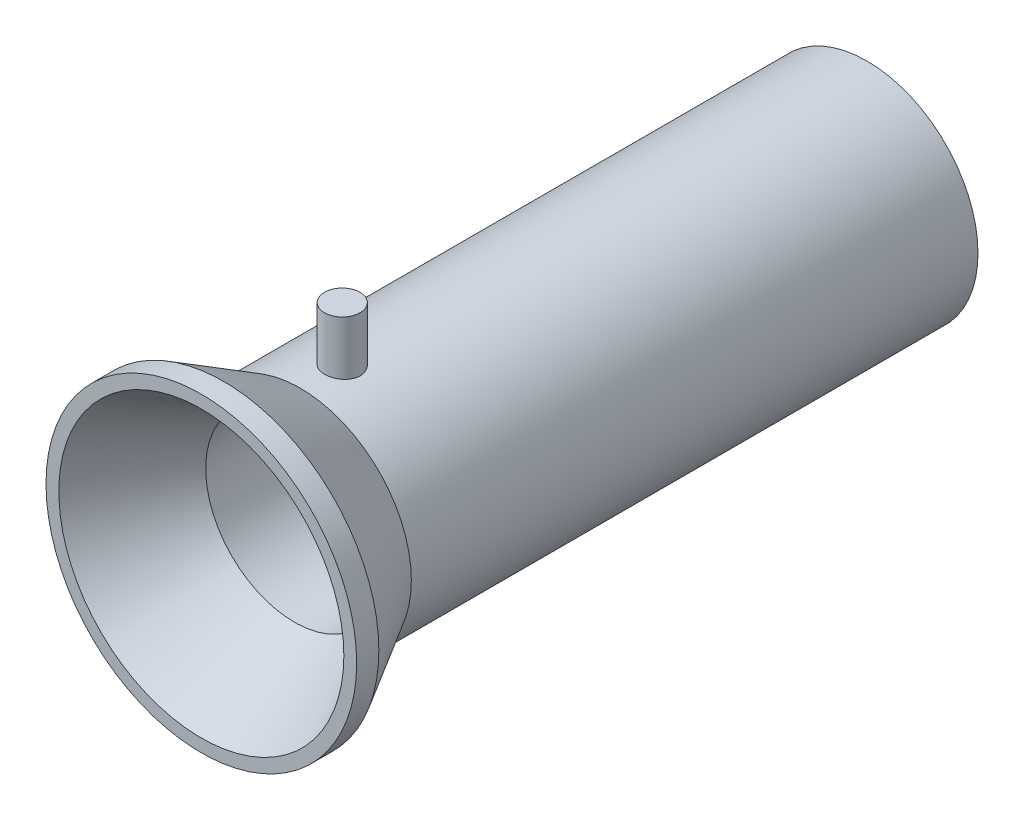
ISO-10303-21;
HEADER;
FILE_DESCRIPTION(('STEP AP214'),'2;1');
FILE_NAME('part.step','',(''),(''),'','','');
FILE_SCHEMA(('AUTOMOTIVE_DESIGN { 1 0 10303 214 1 1 1 1 }'));
ENDSEC;
DATA;
#1=APPLICATION_CONTEXT('core data for automotive mechanical design processes');
#2=APPLICATION_PROTOCOL_DEFINITION('international standard','automotive_design',2000,#1);
#3=PRODUCT_CONTEXT('',#1,'mechanical');
#4=PRODUCT('Part','Part','',(#3));
#5=PRODUCT_RELATED_PRODUCT_CATEGORY('part','',(#4));
#6=PRODUCT_DEFINITION_FORMATION('','',#4);
#7=PRODUCT_DEFINITION_CONTEXT('part definition',#1,'design');
#8=PRODUCT_DEFINITION('design','',#6,#7);
#9=PRODUCT_DEFINITION_SHAPE('','',#8);
#10=(LENGTH_UNIT() NAMED_UNIT(*) SI_UNIT(.MILLI.,.METRE.));
#11=(NAMED_UNIT(*) PLANE_ANGLE_UNIT() SI_UNIT($,.RADIAN.));
#12=(NAMED_UNIT(*) SI_UNIT($,.STERADIAN.) SOLID_ANGLE_UNIT());
#13=UNCERTAINTY_MEASURE_WITH_UNIT(LENGTH_MEASURE(1.E-05),#10,'distance_accuracy_value','');
#14=(GEOMETRIC_REPRESENTATION_CONTEXT(3) GLOBAL_UNCERTAINTY_ASSIGNED_CONTEXT((#13)) GLOBAL_UNIT_ASSIGNED_CONTEXT((#10,
#11,#12)) REPRESENTATION_CONTEXT('',''));
#15=CARTESIAN_POINT('',(0.,0.,0.));
#16=DIRECTION('',(0.,0.,1.));
#17=DIRECTION('',(1.,0.,0.));
#18=AXIS2_PLACEMENT_3D('',#15,#16,#17);
#19=CARTESIAN_POINT('',(0.,0.,0.));
#20=DIRECTION('',(0.,0.,1.));
#21=DIRECTION('',(1.,0.,0.));
#22=AXIS2_PLACEMENT_3D('',#19,#20,#21);
#23=CYLINDRICAL_SURFACE('',#22,25.);
#24=CARTESIAN_POINT('',(0.,25.,-27.7583302491977));
#25=CARTESIAN_POINT('',(0.223154040255867,24.9999962684199,-27.7583393064581));
#26=CARTESIAN_POINT('',(0.446433047720668,24.9969809352746,-27.777067463784));
#27=CARTESIAN_POINT('',(0.886737559316476,24.9852424683713,-27.8514591445937));
#28=CARTESIAN_POINT('',(1.10375697227035,24.9765139586209,-27.907157456998));
#29=CARTESIAN_POINT('',(1.52510754225258,24.9543289280258,-28.0537720100897));
#30=CARTESIAN_POINT('',(1.72944860588801,24.9408761547967,-28.1446603414393));
#31=CARTESIAN_POINT('',(2.11995168869092,24.9107247960231,-28.3590038379933));
#32=CARTESIAN_POINT('',(2.30611596589786,24.8940266144171,-28.482454950965));
#33=CARTESIAN_POINT('',(2.65665499209348,24.8590728580675,-28.7595814577226));
#34=CARTESIAN_POINT('',(2.82084573305194,24.8408060088607,-28.913488207088));
#35=CARTESIAN_POINT('',(3.12118820567566,24.8048607981876,-29.2466591837476));
#36=CARTESIAN_POINT('',(3.25733823381418,24.7871824725299,-29.4259249505351));
#37=CARTESIAN_POINT('',(3.49846330826428,24.7543066715639,-29.8059780215018));
#38=CARTESIAN_POINT('',(3.60325799692193,24.73912376697,-30.0068811239209));
#39=CARTESIAN_POINT('',(3.77754461925213,24.713113318991,-30.4237215749353));
#40=CARTESIAN_POINT('',(3.84703874636018,24.7022855050068,-30.6396579884727));
#41=CARTESIAN_POINT('',(3.94817517362655,24.6863228948473,-31.0784910029273));
#42=CARTESIAN_POINT('',(3.980134089008,24.6811405060072,-31.3013128710978));
#43=CARTESIAN_POINT('',(4.00627422675154,24.6769113431822,-31.7492122233686));
#44=CARTESIAN_POINT('',(4.00045791388385,24.6778641688848,-31.9742895593467));
#45=CARTESIAN_POINT('',(3.95147094116269,24.6857542961208,-32.4180603101956));
#46=CARTESIAN_POINT('',(3.90865469452829,24.6926348158353,-32.6367940039198));
#47=CARTESIAN_POINT('',(3.78743887027681,24.7115162640347,-33.0639323913936));
#48=CARTESIAN_POINT('',(3.70903815991343,24.72351735552,-33.2723367560995));
#49=CARTESIAN_POINT('',(3.51851577494413,24.751349636532,-33.6739687849094));
#50=CARTESIAN_POINT('',(3.40624571635019,24.7671976186138,-33.8671248485685));
#51=CARTESIAN_POINT('',(3.15127705264725,24.8009261622985,-34.2319907925684));
#52=CARTESIAN_POINT('',(3.00857618031073,24.8188068753022,-34.4036990734441));
#53=CARTESIAN_POINT('',(2.69485968175784,24.8548362490508,-34.7228478500724));
#54=CARTESIAN_POINT('',(2.52353971091198,24.8729856400542,-34.8699892633353));
#55=CARTESIAN_POINT('',(2.15848074936105,24.9073185416933,-35.1334797268837));
#56=CARTESIAN_POINT('',(1.96474163443276,24.9235020414351,-35.2498286065379));
#57=CARTESIAN_POINT('',(1.56007177661824,24.9521001139888,-35.4484536054257));
#58=CARTESIAN_POINT('',(1.34912853484306,24.9645119151413,-35.5307046837354));
#59=CARTESIAN_POINT('',(0.916179667879541,24.984145511872,-35.6585289650497));
#60=CARTESIAN_POINT('',(0.694174896141458,24.9913677071923,-35.7041049930718));
#61=CARTESIAN_POINT('',(0.247984110803936,24.9997549291012,-35.7568831892236));
#62=CARTESIAN_POINT('',(0.0238478673208719,25.0009847993513,-35.764496181113));
#63=CARTESIAN_POINT('',(-0.42249874302229,24.9974259501866,-35.7422254859792));
#64=CARTESIAN_POINT('',(-0.644709177708579,24.992637443611,-35.712343124975));
#65=CARTESIAN_POINT('',(-1.07963759647102,24.9776200030468,-35.6162716528192));
#66=CARTESIAN_POINT('',(-1.29240134880417,24.9674213560511,-35.5502845985886));
#67=CARTESIAN_POINT('',(-1.70384598117199,24.9427229229552,-35.3840913121376));
#68=CARTESIAN_POINT('',(-1.90252612198239,24.9282229112907,-35.2838832853215));
#69=CARTESIAN_POINT('',(-2.28195730225774,24.8963704303685,-35.0511422505911));
#70=CARTESIAN_POINT('',(-2.46254800619141,24.8789955511662,-34.9183509771516));
#71=CARTESIAN_POINT('',(-2.79902831279057,24.8433919082741,-34.6245699404727));
#72=CARTESIAN_POINT('',(-2.95491626880566,24.8251630877667,-34.4635782989412));
#73=CARTESIAN_POINT('',(-3.23907733060002,24.7896980546147,-34.1161294729898));
#74=CARTESIAN_POINT('',(-3.3670737482944,24.7724729290756,-33.9294446916241));
#75=CARTESIAN_POINT('',(-3.58988978420239,24.7411682060349,-33.536982686957));
#76=CARTESIAN_POINT('',(-3.68471039247671,24.7270885146691,-33.3312060336435));
#77=CARTESIAN_POINT('',(-3.83806316708309,24.7037508240956,-32.9071963307613));
#78=CARTESIAN_POINT('',(-3.89673629805032,24.6944741175445,-32.689015340002));
#79=CARTESIAN_POINT('',(-3.97657437108919,24.6817446444144,-32.2457351092137));
#80=CARTESIAN_POINT('',(-3.99774229496909,24.6782914148477,-32.020636420616));
#81=CARTESIAN_POINT('',(-4.00189093236788,24.6776187517139,-31.5726712623245));
#82=CARTESIAN_POINT('',(-3.98530695642893,24.680328256433,-31.3498088101182));
#83=CARTESIAN_POINT('',(-3.9153603594595,24.6915205651642,-30.9100876039432));
#84=CARTESIAN_POINT('',(-3.86199783155724,24.7000033545575,-30.6932288347739));
#85=CARTESIAN_POINT('',(-3.72017043710126,24.7217603172402,-30.2718195491648));
#86=CARTESIAN_POINT('',(-3.63174015540267,24.7350297686206,-30.0672571339151));
#87=CARTESIAN_POINT('',(-3.42233154568487,24.7648699534816,-29.6758013138516));
#88=CARTESIAN_POINT('',(-3.30135181249014,24.7814408294783,-29.4889086723212));
#89=CARTESIAN_POINT('',(-3.02871327199353,24.8162433615403,-29.1358930875246));
#90=CARTESIAN_POINT('',(-2.87673329161918,24.834491204356,-28.9700197533969));
#91=CARTESIAN_POINT('',(-2.54708668715905,24.8704600259951,-28.6659794864027));
#92=CARTESIAN_POINT('',(-2.36941412804009,24.8881808819399,-28.5278189729003));
#93=CARTESIAN_POINT('',(-1.99209669315466,24.921228112583,-28.2823353168541));
#94=CARTESIAN_POINT('',(-1.79232009958969,24.9365386530592,-28.1752125014229));
#95=CARTESIAN_POINT('',(-1.37745033393731,24.9628857500936,-27.9962076633995));
#96=CARTESIAN_POINT('',(-1.16237292241951,24.9739266312466,-27.9242899629898));
#97=CARTESIAN_POINT('',(-0.788671037676078,24.9880351179278,-27.8336387717268));
#98=CARTESIAN_POINT('',(-0.632326954997383,24.9924983556635,-27.8054424436121));
#99=CARTESIAN_POINT('',(-0.317342960303406,24.9984821013428,-27.7677851034705));
#100=CARTESIAN_POINT('',(-0.158703083077655,25.0000026538317,-27.7583238078393));
#101=CARTESIAN_POINT('',(0.,25.,-27.7583302491977));
#102=B_SPLINE_CURVE_WITH_KNOTS('',3,(#24,#25,#26,#27,#28,#29,#30,#31,#32,#33,#34,#35,#36,#37,
#38,#39,#40,#41,#42,#43,#44,#45,#46,#47,#48,#49,#50,#51,#52,#53,#54,#55,#56,#57,#58,#59,#60,#61,
#62,#63,#64,#65,#66,#67,#68,#69,#70,#71,#72,#73,#74,#75,#76,#77,#78,#79,#80,#81,#82,#83,#84,#85,
#86,#87,#88,#89,#90,#91,#92,#93,#94,#95,#96,#97,#98,#99,#100,#101),.UNSPECIFIED.,.T.,.F.,(4,2,2,
2,2,2,2,2,2,2,2,2,2,2,2,2,2,2,2,2,2,2,2,2,2,2,2,2,2,2,2,2,2,2,2,2,2,2,4),(0.,0.66888209324589,
1.33839449863893,2.00737699531371,2.67627628058208,3.35046669216468,4.02469805002561,
4.70273619251891,5.38073219928275,6.05296716939299,6.72515827774052,7.39098111780999,
8.05682515424385,8.72562974136637,9.39448417474969,10.0709662667478,10.7474521072744,
11.4244338727204,12.1013634864039,12.7709514430023,13.4405157203627,14.106370604541,
14.7722604124451,15.4436091856769,16.1150026912654,16.7927805417321,17.4705381636504,
18.1456357152063,18.8206795915005,19.4879791369228,20.1552769926597,20.8219183697352,
21.4885885306597,22.1625526170809,22.8366726398947,23.5150513730047,24.1927411880703,
24.6684451333997,25.144141877639),.UNSPECIFIED.);
#103=CARTESIAN_POINT('',(0.,25.,-27.7583302491977));
#104=VERTEX_POINT('',#103);
#105=EDGE_CURVE('E65',#104,#104,#102,.T.);
#106=ORIENTED_EDGE('',*,*,#105,.F.);
#107=EDGE_LOOP('',(#106));
#108=FACE_BOUND('',#107,.T.);
#109=CARTESIAN_POINT('',(0.,0.,-22.3205080756887));
#110=DIRECTION('',(0.,0.,1.));
#111=DIRECTION('',(1.,0.,0.));
#112=AXIS2_PLACEMENT_3D('',#109,#110,#111);
#113=CIRCLE('',#112,25.);
#114=CARTESIAN_POINT('',(25.,0.,-22.3205080756887));
#115=VERTEX_POINT('',#114);
#116=EDGE_CURVE('E49',#115,#115,#113,.T.);
#117=ORIENTED_EDGE('',*,*,#116,.F.);
#118=EDGE_LOOP('',(#117));
#119=FACE_BOUND('',#118,.T.);
#120=CARTESIAN_POINT('',(0.,-25.,-35.7583302491977));
#121=CARTESIAN_POINT('',(0.223154040255867,-24.9999962684199,-35.7583211919374));
#122=CARTESIAN_POINT('',(0.446433047720668,-24.9969809352746,-35.7395930346114));
#123=CARTESIAN_POINT('',(0.886737559316476,-24.9852424683713,-35.6652013538017));
#124=CARTESIAN_POINT('',(1.10375697227035,-24.9765139586209,-35.6095030413974));
#125=CARTESIAN_POINT('',(1.52510754225258,-24.9543289280258,-35.4628884883057));
#126=CARTESIAN_POINT('',(1.72944860588802,-24.9408761547967,-35.3720001569561));
#127=CARTESIAN_POINT('',(2.11995168869093,-24.9107247960231,-35.1576566604021));
#128=CARTESIAN_POINT('',(2.30611596589787,-24.8940266144171,-35.0342055474304));
#129=CARTESIAN_POINT('',(2.65665499209349,-24.8590728580675,-34.7570790406728));
#130=CARTESIAN_POINT('',(2.82084573305194,-24.8408060088607,-34.6031722913074));
#131=CARTESIAN_POINT('',(3.12118820567566,-24.8048607981876,-34.2700013146478));
#132=CARTESIAN_POINT('',(3.25733823381418,-24.7871824725299,-34.0907355478603));
#133=CARTESIAN_POINT('',(3.49846330826428,-24.7543066715639,-33.7106824768936));
#134=CARTESIAN_POINT('',(3.60325799692193,-24.73912376697,-33.5097793744745));
#135=CARTESIAN_POINT('',(3.77754461925213,-24.713113318991,-33.0929389234601));
#136=CARTESIAN_POINT('',(3.84703874636018,-24.7022855050068,-32.8770025099228));
#137=CARTESIAN_POINT('',(3.94817517362655,-24.6863228948473,-32.4381694954681));
#138=CARTESIAN_POINT('',(3.980134089008,-24.6811405060072,-32.2153476272976));
#139=CARTESIAN_POINT('',(4.00627422675154,-24.6769113431822,-31.7674482750268));
#140=CARTESIAN_POINT('',(4.00045791388385,-24.6778641688848,-31.5423709390487));
#141=CARTESIAN_POINT('',(3.95147094116269,-24.6857542961208,-31.0986001881998));
#142=CARTESIAN_POINT('',(3.90865469452829,-24.6926348158353,-30.8798664944756));
#143=CARTESIAN_POINT('',(3.78743887027681,-24.7115162640347,-30.4527281070018));
#144=CARTESIAN_POINT('',(3.70903815991343,-24.72351735552,-30.2443237422959));
#145=CARTESIAN_POINT('',(3.51851577494413,-24.751349636532,-29.842691713486));
#146=CARTESIAN_POINT('',(3.40624571635019,-24.7671976186138,-29.6495356498269));
#147=CARTESIAN_POINT('',(3.15127705264726,-24.8009261622985,-29.284669705827));
#148=CARTESIAN_POINT('',(3.00857618031073,-24.8188068753022,-29.1129614249513));
#149=CARTESIAN_POINT('',(2.69485968175784,-24.8548362490508,-28.793812648323));
#150=CARTESIAN_POINT('',(2.52353971091198,-24.8729856400542,-28.6466712350601));
#151=CARTESIAN_POINT('',(2.15848074936105,-24.9073185416933,-28.3831807715117));
#152=CARTESIAN_POINT('',(1.96474163443276,-24.9235020414351,-28.2668318918576));
#153=CARTESIAN_POINT('',(1.56007177661824,-24.9521001139888,-28.0682068929697));
#154=CARTESIAN_POINT('',(1.34912853484306,-24.9645119151413,-27.98595581466));
#155=CARTESIAN_POINT('',(0.916179667879539,-24.984145511872,-27.8581315333457));
#156=CARTESIAN_POINT('',(0.694174896141457,-24.9913677071923,-27.8125555053236));
#157=CARTESIAN_POINT('',(0.247984110803936,-24.9997549291012,-27.7597773091718));
#158=CARTESIAN_POINT('',(0.023847867320872,-25.0009847993513,-27.7521643172824));
#159=CARTESIAN_POINT('',(-0.42249874302229,-24.9974259501866,-27.7744350124162));
#160=CARTESIAN_POINT('',(-0.64470917770858,-24.992637443611,-27.8043173734204));
#161=CARTESIAN_POINT('',(-1.07963759647102,-24.9776200030468,-27.9003888455762));
#162=CARTESIAN_POINT('',(-1.29240134880417,-24.9674213560511,-27.9663758998068));
#163=CARTESIAN_POINT('',(-1.70384598117199,-24.9427229229552,-28.1325691862578));
#164=CARTESIAN_POINT('',(-1.90252612198239,-24.9282229112907,-28.2327772130739));
#165=CARTESIAN_POINT('',(-2.28195730225774,-24.8963704303685,-28.4655182478043));
#166=CARTESIAN_POINT('',(-2.46254800619141,-24.8789955511662,-28.5983095212438));
#167=CARTESIAN_POINT('',(-2.79902831279057,-24.8433919082741,-28.8920905579227));
#168=CARTESIAN_POINT('',(-2.95491626880566,-24.8251630877667,-29.0530821994542));
#169=CARTESIAN_POINT('',(-3.23907733060002,-24.7896980546147,-29.4005310254056));
#170=CARTESIAN_POINT('',(-3.3670737482944,-24.7724729290756,-29.5872158067713));
#171=CARTESIAN_POINT('',(-3.5898897842024,-24.7411682060349,-29.9796778114384));
#172=CARTESIAN_POINT('',(-3.68471039247671,-24.7270885146691,-30.1854544647519));
#173=CARTESIAN_POINT('',(-3.83806316708309,-24.7037508240956,-30.6094641676341));
#174=CARTESIAN_POINT('',(-3.89673629805032,-24.6944741175445,-30.8276451583934));
#175=CARTESIAN_POINT('',(-3.97657437108919,-24.6817446444144,-31.2709253891817));
#176=CARTESIAN_POINT('',(-3.99774229496909,-24.6782914148477,-31.4960240777794));
#177=CARTESIAN_POINT('',(-4.00189093236788,-24.6776187517139,-31.943989236071));
#178=CARTESIAN_POINT('',(-3.98530695642893,-24.680328256433,-32.1668516882772));
#179=CARTESIAN_POINT('',(-3.9153603594595,-24.6915205651642,-32.6065728944522));
#180=CARTESIAN_POINT('',(-3.86199783155724,-24.7000033545575,-32.8234316636215));
#181=CARTESIAN_POINT('',(-3.72017043710126,-24.7217603172402,-33.2448409492306));
#182=CARTESIAN_POINT('',(-3.63174015540267,-24.7350297686206,-33.4494033644803));
#183=CARTESIAN_POINT('',(-3.42233154568487,-24.7648699534816,-33.8408591845439));
#184=CARTESIAN_POINT('',(-3.30135181249014,-24.7814408294783,-34.0277518260742));
#185=CARTESIAN_POINT('',(-3.02871327199353,-24.8162433615403,-34.3807674108708));
#186=CARTESIAN_POINT('',(-2.87673329161918,-24.834491204356,-34.5466407449985));
#187=CARTESIAN_POINT('',(-2.54708668715906,-24.8704600259951,-34.8506810119927));
#188=CARTESIAN_POINT('',(-2.36941412804009,-24.8881808819399,-34.9888415254951));
#189=CARTESIAN_POINT('',(-1.99209669315467,-24.921228112583,-35.2343251815413));
#190=CARTESIAN_POINT('',(-1.79232009958969,-24.9365386530592,-35.3414479969725));
#191=CARTESIAN_POINT('',(-1.37745033393731,-24.9628857500936,-35.5204528349959));
#192=CARTESIAN_POINT('',(-1.1623729224195,-24.9739266312466,-35.5923705354057));
#193=CARTESIAN_POINT('',(-0.788671037676074,-24.9880351179278,-35.6830217266687));
#194=CARTESIAN_POINT('',(-0.632326954997379,-24.9924983556635,-35.7112180547833));
#195=CARTESIAN_POINT('',(-0.317342960303403,-24.9984821013428,-35.7488753949249));
#196=CARTESIAN_POINT('',(-0.158703083077654,-25.0000026538317,-35.7583366905561));
#197=CARTESIAN_POINT('',(0.,-25.,-35.7583302491977));
#198=B_SPLINE_CURVE_WITH_KNOTS('',3,(#120,#121,#122,#123,#124,#125,#126,#127,#128,#129,#130,
#131,#132,#133,#134,#135,#136,#137,#138,#139,#140,#141,#142,#143,#144,#145,#146,#147,#148,#149,
#150,#151,#152,#153,#154,#155,#156,#157,#158,#159,#160,#161,#162,#163,#164,#165,#166,#167,#168,
#169,#170,#171,#172,#173,#174,#175,#176,#177,#178,#179,#180,#181,#182,#183,#184,#185,#186,#187,
#188,#189,#190,#191,#192,#193,#194,#195,#196,#197),.UNSPECIFIED.,.T.,.F.,(4,2,2,2,2,2,2,2,2,2,2,
2,2,2,2,2,2,2,2,2,2,2,2,2,2,2,2,2,2,2,2,2,2,2,2,2,2,2,4),(0.,0.668882093245891,1.33839449863894,
2.00737699531371,2.67627628058208,3.35046669216468,4.02469805002561,4.70273619251891,
5.38073219928275,6.052967169393,6.72515827774053,7.39098111780999,8.05682515424385,
8.72562974136636,9.39448417474968,10.0709662667478,10.7474521072744,11.4244338727204,
12.1013634864039,12.7709514430023,13.4405157203627,14.106370604541,14.7722604124451,
15.4436091856769,16.1150026912654,16.7927805417321,17.4705381636504,18.1456357152063,
18.8206795915005,19.4879791369228,20.1552769926597,20.8219183697352,21.4885885306597,
22.1625526170809,22.8366726398947,23.5150513730047,24.1927411880703,24.6684451333997,
25.144141877639),.UNSPECIFIED.);
#199=CARTESIAN_POINT('',(0.,-25.,-35.7583302491977));
#200=VERTEX_POINT('',#199);
#201=EDGE_CURVE('E10',#200,#200,#198,.T.);
#202=ORIENTED_EDGE('',*,*,#201,.F.);
#203=EDGE_LOOP('',(#202));
#204=FACE_BOUND('',#203,.T.);
#205=CARTESIAN_POINT('',(0.,0.,-150.));
#206=DIRECTION('',(0.,0.,-1.));
#207=DIRECTION('',(-1.,0.,0.));
#208=AXIS2_PLACEMENT_3D('',#205,#206,#207);
#209=CIRCLE('',#208,25.);
#210=CARTESIAN_POINT('',(-25.,0.,-150.));
#211=VERTEX_POINT('',#210);
#212=EDGE_CURVE('E126',#211,#211,#209,.T.);
#213=ORIENTED_EDGE('',*,*,#212,.F.);
#214=EDGE_LOOP('',(#213));
#215=FACE_BOUND('',#214,.T.);
#216=ADVANCED_FACE('F33',(#108,#119,#204,#215),#23,.T.);
#217=CARTESIAN_POINT('',(0.,0.,0.));
#218=DIRECTION('',(0.,0.,1.));
#219=DIRECTION('',(1.,0.,0.));
#220=AXIS2_PLACEMENT_3D('',#217,#218,#219);
#221=CYLINDRICAL_SURFACE('',#220,35.);
#222=CARTESIAN_POINT('',(0.,0.,0.));
#223=DIRECTION('',(0.,0.,1.));
#224=DIRECTION('',(1.,0.,0.));
#225=AXIS2_PLACEMENT_3D('',#222,#223,#224);
#226=CIRCLE('',#225,35.);
#227=CARTESIAN_POINT('',(35.,0.,0.));
#228=VERTEX_POINT('',#227);
#229=EDGE_CURVE('E61',#228,#228,#226,.T.);
#230=ORIENTED_EDGE('',*,*,#229,.F.);
#231=EDGE_LOOP('',(#230));
#232=FACE_BOUND('',#231,.T.);
#233=CARTESIAN_POINT('',(0.,0.,-5.));
#234=DIRECTION('',(0.,0.,1.));
#235=DIRECTION('',(1.,0.,0.));
#236=AXIS2_PLACEMENT_3D('',#233,#234,#235);
#237=CIRCLE('',#236,35.);
#238=CARTESIAN_POINT('',(35.,0.,-5.));
#239=VERTEX_POINT('',#238);
#240=EDGE_CURVE('E45',#239,#239,#237,.T.);
#241=ORIENTED_EDGE('',*,*,#240,.T.);
#242=EDGE_LOOP('',(#241));
#243=FACE_BOUND('',#242,.T.);
#244=ADVANCED_FACE('F35',(#232,#243),#221,.T.);
#245=CARTESIAN_POINT('',(0.,0.,-22.3205080756887));
#246=DIRECTION('',(0.,0.,1.));
#247=DIRECTION('',(1.,0.,0.));
#248=AXIS2_PLACEMENT_3D('',#245,#246,#247);
#249=CONICAL_SURFACE('',#248,25.,0.5235987755983);
#250=ORIENTED_EDGE('',*,*,#240,.F.);
#251=EDGE_LOOP('',(#250));
#252=FACE_BOUND('',#251,.T.);
#253=ORIENTED_EDGE('',*,*,#116,.T.);
#254=EDGE_LOOP('',(#253));
#255=FACE_BOUND('',#254,.T.);
#256=ADVANCED_FACE('F106',(#252,#255),#249,.T.);
#257=CARTESIAN_POINT('',(0.,0.,0.));
#258=DIRECTION('',(0.,0.,1.));
#259=DIRECTION('',(1.,0.,0.));
#260=AXIS2_PLACEMENT_3D('',#257,#258,#259);
#261=CYLINDRICAL_SURFACE('',#260,20.);
#262=CARTESIAN_POINT('',(0.,0.,-20.9807621135331));
#263=DIRECTION('',(0.,0.,1.));
#264=DIRECTION('',(1.,0.,0.));
#265=AXIS2_PLACEMENT_3D('',#262,#263,#264);
#266=CIRCLE('',#265,20.);
#267=CARTESIAN_POINT('',(20.,0.,-20.9807621135331));
#268=VERTEX_POINT('',#267);
#269=EDGE_CURVE('E53',#268,#268,#266,.T.);
#270=ORIENTED_EDGE('',*,*,#269,.T.);
#271=EDGE_LOOP('',(#270));
#272=FACE_BOUND('',#271,.T.);
#273=CARTESIAN_POINT('',(0.,0.,-150.));
#274=DIRECTION('',(0.,0.,-1.));
#275=DIRECTION('',(-1.,0.,0.));
#276=AXIS2_PLACEMENT_3D('',#273,#274,#275);
#277=CIRCLE('',#276,20.);
#278=CARTESIAN_POINT('',(-20.,0.,-150.));
#279=VERTEX_POINT('',#278);
#280=EDGE_CURVE('E127',#279,#279,#277,.T.);
#281=ORIENTED_EDGE('',*,*,#280,.T.);
#282=EDGE_LOOP('',(#281));
#283=FACE_BOUND('',#282,.T.);
#284=ADVANCED_FACE('F112',(#272,#283),#261,.F.);
#285=CARTESIAN_POINT('',(0.,0.,0.));
#286=DIRECTION('',(0.,0.,1.));
#287=DIRECTION('',(1.,0.,0.));
#288=AXIS2_PLACEMENT_3D('',#285,#286,#287);
#289=CONICAL_SURFACE('',#288,32.1132486540519,0.5235987755983);
#290=ORIENTED_EDGE('',*,*,#269,.F.);
#291=EDGE_LOOP('',(#290));
#292=FACE_BOUND('',#291,.T.);
#293=CARTESIAN_POINT('',(0.,0.,0.));
#294=DIRECTION('',(0.,0.,1.));
#295=DIRECTION('',(1.,0.,0.));
#296=AXIS2_PLACEMENT_3D('',#293,#294,#295);
#297=CIRCLE('',#296,32.1132486540519);
#298=CARTESIAN_POINT('',(32.1132486540519,0.,0.));
#299=VERTEX_POINT('',#298);
#300=EDGE_CURVE('E58',#299,#299,#297,.T.);
#301=ORIENTED_EDGE('',*,*,#300,.T.);
#302=EDGE_LOOP('',(#301));
#303=FACE_BOUND('',#302,.T.);
#304=ADVANCED_FACE('F119',(#292,#303),#289,.F.);
#305=CARTESIAN_POINT('',(0.,32.1132486540519,0.));
#306=DIRECTION('',(0.,0.,-1.));
#307=DIRECTION('',(-1.,0.,0.));
#308=AXIS2_PLACEMENT_3D('',#305,#306,#307);
#309=PLANE('',#308);
#310=ORIENTED_EDGE('',*,*,#300,.F.);
#311=EDGE_LOOP('',(#310));
#312=FACE_BOUND('',#311,.T.);
#313=ORIENTED_EDGE('',*,*,#229,.T.);
#314=EDGE_LOOP('',(#313));
#315=FACE_BOUND('',#314,.T.);
#316=ADVANCED_FACE('F82',(#312,#315),#309,.F.);
#317=CARTESIAN_POINT('',(0.,37.,-31.7583302491977));
#318=DIRECTION('',(0.,1.,0.));
#319=DIRECTION('',(0.,0.,1.));
#320=AXIS2_PLACEMENT_3D('',#317,#318,#319);
#321=PLANE('',#320);
#322=CARTESIAN_POINT('',(0.,37.,-31.7583302491977));
#323=DIRECTION('',(0.,1.,0.));
#324=DIRECTION('',(0.,0.,1.));
#325=AXIS2_PLACEMENT_3D('',#322,#323,#324);
#326=CIRCLE('',#325,4.);
#327=CARTESIAN_POINT('',(0.,37.,-27.7583302491977));
#328=VERTEX_POINT('',#327);
#329=EDGE_CURVE('E64',#328,#328,#326,.T.);
#330=ORIENTED_EDGE('',*,*,#329,.T.);
#331=EDGE_LOOP('',(#330));
#332=FACE_BOUND('',#331,.T.);
#333=ADVANCED_FACE('F80',(#332),#321,.T.);
#334=CARTESIAN_POINT('',(0.,-35.002,-31.7583302491977));
#335=DIRECTION('',(0.,1.,0.));
#336=DIRECTION('',(0.,0.,1.));
#337=AXIS2_PLACEMENT_3D('',#334,#335,#336);
#338=CYLINDRICAL_SURFACE('',#337,4.);
#339=ORIENTED_EDGE('',*,*,#329,.F.);
#340=EDGE_LOOP('',(#339));
#341=FACE_BOUND('',#340,.T.);
#342=ORIENTED_EDGE('',*,*,#105,.T.);
#343=EDGE_LOOP('',(#342));
#344=FACE_BOUND('',#343,.T.);
#345=ADVANCED_FACE('F75',(#341,#344),#338,.T.);
#346=CARTESIAN_POINT('',(0.,-37.,-31.7583302491977));
#347=DIRECTION('',(0.,-1.,0.));
#348=DIRECTION('',(0.,0.,1.));
#349=AXIS2_PLACEMENT_3D('',#346,#347,#348);
#350=PLANE('',#349);
#351=CARTESIAN_POINT('',(0.,-37.,-31.7583302491977));
#352=DIRECTION('',(0.,1.,0.));
#353=DIRECTION('',(0.,0.,1.));
#354=AXIS2_PLACEMENT_3D('',#351,#352,#353);
#355=CIRCLE('',#354,4.);
#356=CARTESIAN_POINT('',(0.,-37.,-27.7583302491977));
#357=VERTEX_POINT('',#356);
#358=EDGE_CURVE('E73',#357,#357,#355,.T.);
#359=ORIENTED_EDGE('',*,*,#358,.F.);
#360=EDGE_LOOP('',(#359));
#361=FACE_BOUND('',#360,.T.);
#362=ADVANCED_FACE('F89',(#361),#350,.T.);
#363=CARTESIAN_POINT('',(0.,37.002,-31.7583302491977));
#364=DIRECTION('',(0.,-1.,0.));
#365=DIRECTION('',(0.,0.,-1.));
#366=AXIS2_PLACEMENT_3D('',#363,#364,#365);
#367=CYLINDRICAL_SURFACE('',#366,4.);
#368=ORIENTED_EDGE('',*,*,#358,.T.);
#369=EDGE_LOOP('',(#368));
#370=FACE_BOUND('',#369,.T.);
#371=ORIENTED_EDGE('',*,*,#201,.T.);
#372=EDGE_LOOP('',(#371));
#373=FACE_BOUND('',#372,.T.);
#374=ADVANCED_FACE('F84',(#370,#373),#367,.T.);
#375=CARTESIAN_POINT('',(0.,0.,-150.));
#376=DIRECTION('',(0.,0.,-1.));
#377=DIRECTION('',(-1.,0.,0.));
#378=AXIS2_PLACEMENT_3D('',#375,#376,#377);
#379=PLANE('',#378);
#380=ORIENTED_EDGE('',*,*,#212,.T.);
#381=EDGE_LOOP('',(#380));
#382=FACE_BOUND('',#381,.T.);
#383=ORIENTED_EDGE('',*,*,#280,.F.);
#384=EDGE_LOOP('',(#383));
#385=FACE_BOUND('',#384,.T.);
#386=ADVANCED_FACE('F88',(#382,#385),#379,.T.);
#387=CLOSED_SHELL('',(#216,#244,#256,#284,#304,#316,#333,#345,#362,#374,#386));
#388=MANIFOLD_SOLID_BREP('B2',#387);
#389=ADVANCED_BREP_SHAPE_REPRESENTATION('',(#18,#388),#14);
#390=SHAPE_DEFINITION_REPRESENTATION(#9,#389);
ENDSEC;
END-ISO-10303-21;
